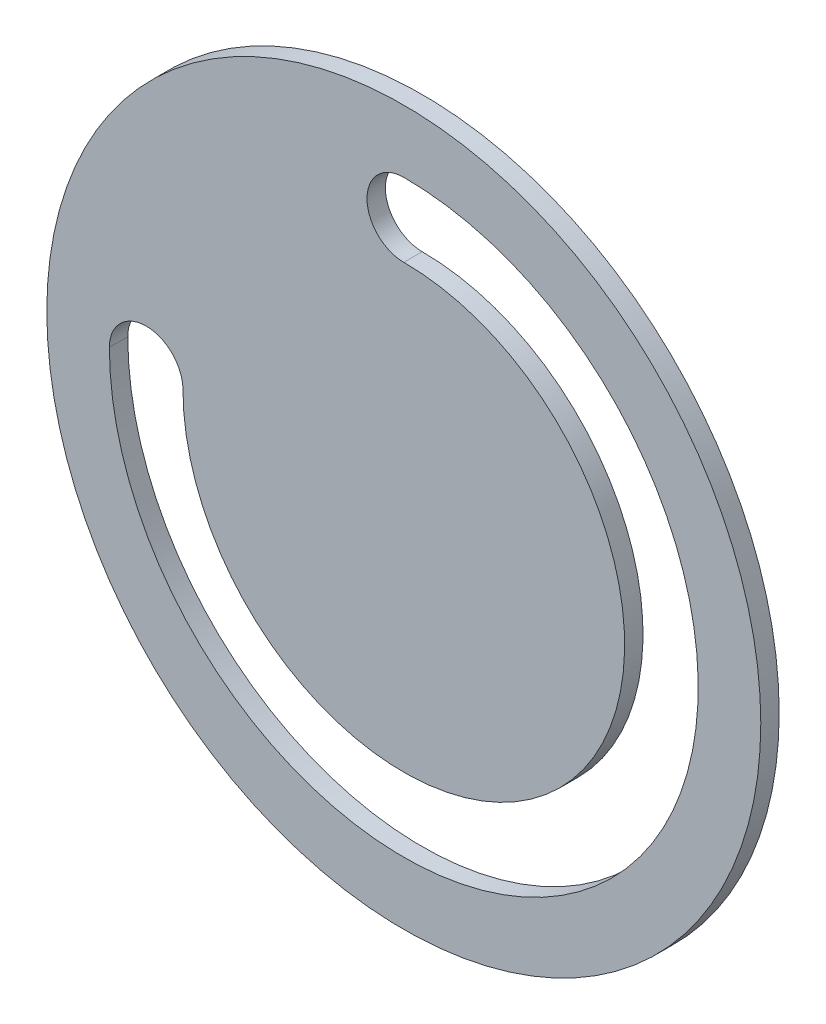
ISO-10303-21;
HEADER;
FILE_DESCRIPTION(('STEP AP214'),'2;1');
FILE_NAME('part.step','',(''),(''),'','','');
FILE_SCHEMA(('AUTOMOTIVE_DESIGN { 1 0 10303 214 1 1 1 1 }'));
ENDSEC;
DATA;
#1=APPLICATION_CONTEXT('core data for automotive mechanical design processes');
#2=APPLICATION_PROTOCOL_DEFINITION('international standard','automotive_design',2000,#1);
#3=PRODUCT_CONTEXT('',#1,'mechanical');
#4=PRODUCT('Part','Part','',(#3));
#5=PRODUCT_RELATED_PRODUCT_CATEGORY('part','',(#4));
#6=PRODUCT_DEFINITION_FORMATION('','',#4);
#7=PRODUCT_DEFINITION_CONTEXT('part definition',#1,'design');
#8=PRODUCT_DEFINITION('design','',#6,#7);
#9=PRODUCT_DEFINITION_SHAPE('','',#8);
#10=(LENGTH_UNIT() NAMED_UNIT(*) SI_UNIT(.MILLI.,.METRE.));
#11=(NAMED_UNIT(*) PLANE_ANGLE_UNIT() SI_UNIT($,.RADIAN.));
#12=(NAMED_UNIT(*) SI_UNIT($,.STERADIAN.) SOLID_ANGLE_UNIT());
#13=UNCERTAINTY_MEASURE_WITH_UNIT(LENGTH_MEASURE(1.E-05),#10,'distance_accuracy_value','');
#14=(GEOMETRIC_REPRESENTATION_CONTEXT(3) GLOBAL_UNCERTAINTY_ASSIGNED_CONTEXT((#13)) GLOBAL_UNIT_ASSIGNED_CONTEXT((#10,
#11,#12)) REPRESENTATION_CONTEXT('',''));
#15=CARTESIAN_POINT('',(0.,0.,0.));
#16=DIRECTION('',(0.,0.,1.));
#17=DIRECTION('',(1.,0.,0.));
#18=AXIS2_PLACEMENT_3D('',#15,#16,#17);
#19=CARTESIAN_POINT('',(0.,0.,0.5));
#20=DIRECTION('',(0.,0.,-1.));
#21=DIRECTION('',(-1.,0.,0.));
#22=AXIS2_PLACEMENT_3D('',#19,#20,#21);
#23=CYLINDRICAL_SURFACE('',#22,9.7);
#24=CARTESIAN_POINT('',(0.,0.,0.5));
#25=DIRECTION('',(0.,0.,1.));
#26=DIRECTION('',(1.,0.,0.));
#27=AXIS2_PLACEMENT_3D('',#24,#25,#26);
#28=CIRCLE('',#27,9.7);
#29=CARTESIAN_POINT('',(9.7,0.,0.5));
#30=VERTEX_POINT('',#29);
#31=EDGE_CURVE('E11',#30,#30,#28,.T.);
#32=ORIENTED_EDGE('',*,*,#31,.F.);
#33=EDGE_LOOP('',(#32));
#34=FACE_BOUND('',#33,.T.);
#35=CARTESIAN_POINT('',(0.,0.,0.));
#36=DIRECTION('',(0.,0.,1.));
#37=DIRECTION('',(1.,0.,0.));
#38=AXIS2_PLACEMENT_3D('',#35,#36,#37);
#39=CIRCLE('',#38,9.7);
#40=CARTESIAN_POINT('',(9.7,0.,0.));
#41=VERTEX_POINT('',#40);
#42=EDGE_CURVE('E48',#41,#41,#39,.T.);
#43=ORIENTED_EDGE('',*,*,#42,.T.);
#44=EDGE_LOOP('',(#43));
#45=FACE_BOUND('',#44,.T.);
#46=ADVANCED_FACE('F45',(#34,#45),#23,.T.);
#47=CARTESIAN_POINT('',(0.,0.,0.5));
#48=DIRECTION('',(0.,0.,1.));
#49=DIRECTION('',(1.,0.,0.));
#50=AXIS2_PLACEMENT_3D('',#47,#48,#49);
#51=PLANE('',#50);
#52=CARTESIAN_POINT('',(-7.,0.,0.5));
#53=DIRECTION('',(0.,0.,1.));
#54=DIRECTION('',(1.,0.,0.));
#55=AXIS2_PLACEMENT_3D('',#52,#53,#54);
#56=CIRCLE('',#55,1.);
#57=CARTESIAN_POINT('',(-6.,0.,0.5));
#58=VERTEX_POINT('',#57);
#59=CARTESIAN_POINT('',(-8.,0.,0.5));
#60=VERTEX_POINT('',#59);
#61=EDGE_CURVE('E59',#58,#60,#56,.T.);
#62=ORIENTED_EDGE('',*,*,#61,.F.);
#63=CARTESIAN_POINT('',(0.,0.,0.5));
#64=DIRECTION('',(0.,0.,-1.));
#65=DIRECTION('',(1.,0.,0.));
#66=AXIS2_PLACEMENT_3D('',#63,#64,#65);
#67=CIRCLE('',#66,6.);
#68=CARTESIAN_POINT('',(0.,6.,0.5));
#69=VERTEX_POINT('',#68);
#70=EDGE_CURVE('E103',#69,#58,#67,.T.);
#71=ORIENTED_EDGE('',*,*,#70,.F.);
#72=CARTESIAN_POINT('',(0.,7.,0.5));
#73=DIRECTION('',(0.,0.,1.));
#74=DIRECTION('',(1.,0.,0.));
#75=AXIS2_PLACEMENT_3D('',#72,#73,#74);
#76=CIRCLE('',#75,1.);
#77=CARTESIAN_POINT('',(0.,8.,0.5));
#78=VERTEX_POINT('',#77);
#79=EDGE_CURVE('E106',#78,#69,#76,.T.);
#80=ORIENTED_EDGE('',*,*,#79,.F.);
#81=CARTESIAN_POINT('',(0.,0.,0.5));
#82=DIRECTION('',(0.,0.,1.));
#83=DIRECTION('',(1.,0.,0.));
#84=AXIS2_PLACEMENT_3D('',#81,#82,#83);
#85=CIRCLE('',#84,8.);
#86=EDGE_CURVE('E112',#60,#78,#85,.T.);
#87=ORIENTED_EDGE('',*,*,#86,.F.);
#88=EDGE_LOOP('',(#62,#71,#80,#87));
#89=FACE_BOUND('',#88,.T.);
#90=ORIENTED_EDGE('',*,*,#31,.T.);
#91=EDGE_LOOP('',(#90));
#92=FACE_BOUND('',#91,.T.);
#93=ADVANCED_FACE('F124',(#89,#92),#51,.T.);
#94=CARTESIAN_POINT('',(0.,0.,0.));
#95=DIRECTION('',(0.,0.,1.));
#96=DIRECTION('',(1.,0.,0.));
#97=AXIS2_PLACEMENT_3D('',#94,#95,#96);
#98=PLANE('',#97);
#99=CARTESIAN_POINT('',(0.,0.,0.));
#100=DIRECTION('',(0.,0.,-1.));
#101=DIRECTION('',(1.,0.,0.));
#102=AXIS2_PLACEMENT_3D('',#99,#100,#101);
#103=CIRCLE('',#102,6.);
#104=CARTESIAN_POINT('',(0.,6.,0.));
#105=VERTEX_POINT('',#104);
#106=CARTESIAN_POINT('',(-6.,0.,0.));
#107=VERTEX_POINT('',#106);
#108=EDGE_CURVE('E93',#105,#107,#103,.T.);
#109=ORIENTED_EDGE('',*,*,#108,.T.);
#110=CARTESIAN_POINT('',(-7.,0.,0.));
#111=DIRECTION('',(0.,0.,1.));
#112=DIRECTION('',(1.,0.,0.));
#113=AXIS2_PLACEMENT_3D('',#110,#111,#112);
#114=CIRCLE('',#113,1.);
#115=CARTESIAN_POINT('',(-8.,0.,0.));
#116=VERTEX_POINT('',#115);
#117=EDGE_CURVE('E87',#107,#116,#114,.T.);
#118=ORIENTED_EDGE('',*,*,#117,.T.);
#119=CARTESIAN_POINT('',(0.,0.,0.));
#120=DIRECTION('',(0.,0.,1.));
#121=DIRECTION('',(1.,0.,0.));
#122=AXIS2_PLACEMENT_3D('',#119,#120,#121);
#123=CIRCLE('',#122,8.);
#124=CARTESIAN_POINT('',(0.,8.,0.));
#125=VERTEX_POINT('',#124);
#126=EDGE_CURVE('E96',#116,#125,#123,.T.);
#127=ORIENTED_EDGE('',*,*,#126,.T.);
#128=CARTESIAN_POINT('',(0.,7.,0.));
#129=DIRECTION('',(0.,0.,1.));
#130=DIRECTION('',(1.,0.,0.));
#131=AXIS2_PLACEMENT_3D('',#128,#129,#130);
#132=CIRCLE('',#131,1.);
#133=EDGE_CURVE('E67',#125,#105,#132,.T.);
#134=ORIENTED_EDGE('',*,*,#133,.T.);
#135=EDGE_LOOP('',(#109,#118,#127,#134));
#136=FACE_BOUND('',#135,.T.);
#137=ORIENTED_EDGE('',*,*,#42,.F.);
#138=EDGE_LOOP('',(#137));
#139=FACE_BOUND('',#138,.T.);
#140=ADVANCED_FACE('F100',(#136,#139),#98,.F.);
#141=CARTESIAN_POINT('',(-7.,0.,0.));
#142=DIRECTION('',(0.,0.,1.));
#143=DIRECTION('',(1.,0.,0.));
#144=AXIS2_PLACEMENT_3D('',#141,#142,#143);
#145=CYLINDRICAL_SURFACE('',#144,1.);
#146=ORIENTED_EDGE('',*,*,#61,.T.);
#147=DIRECTION('',(0.,0.,1.));
#148=VECTOR('',#147,1.);
#149=CARTESIAN_POINT('',(-8.,0.,0.));
#150=LINE('',#149,#148);
#151=EDGE_CURVE('E83',#116,#60,#150,.T.);
#152=ORIENTED_EDGE('',*,*,#151,.F.);
#153=ORIENTED_EDGE('',*,*,#117,.F.);
#154=DIRECTION('',(0.,0.,1.));
#155=VECTOR('',#154,1.);
#156=CARTESIAN_POINT('',(-6.,0.,0.));
#157=LINE('',#156,#155);
#158=EDGE_CURVE('E116',#107,#58,#157,.T.);
#159=ORIENTED_EDGE('',*,*,#158,.T.);
#160=EDGE_LOOP('',(#146,#152,#153,#159));
#161=FACE_BOUND('',#160,.T.);
#162=ADVANCED_FACE('F85',(#161),#145,.F.);
#163=CARTESIAN_POINT('',(0.,0.,0.));
#164=DIRECTION('',(0.,0.,1.));
#165=DIRECTION('',(1.,0.,0.));
#166=AXIS2_PLACEMENT_3D('',#163,#164,#165);
#167=CYLINDRICAL_SURFACE('',#166,6.);
#168=ORIENTED_EDGE('',*,*,#70,.T.);
#169=ORIENTED_EDGE('',*,*,#158,.F.);
#170=ORIENTED_EDGE('',*,*,#108,.F.);
#171=DIRECTION('',(0.,0.,1.));
#172=VECTOR('',#171,1.);
#173=CARTESIAN_POINT('',(0.,6.,0.));
#174=LINE('',#173,#172);
#175=EDGE_CURVE('E118',#105,#69,#174,.T.);
#176=ORIENTED_EDGE('',*,*,#175,.T.);
#177=EDGE_LOOP('',(#168,#169,#170,#176));
#178=FACE_BOUND('',#177,.T.);
#179=ADVANCED_FACE('F127',(#178),#167,.T.);
#180=CARTESIAN_POINT('',(0.,7.,0.));
#181=DIRECTION('',(0.,0.,1.));
#182=DIRECTION('',(1.,0.,0.));
#183=AXIS2_PLACEMENT_3D('',#180,#181,#182);
#184=CYLINDRICAL_SURFACE('',#183,1.);
#185=ORIENTED_EDGE('',*,*,#79,.T.);
#186=ORIENTED_EDGE('',*,*,#175,.F.);
#187=ORIENTED_EDGE('',*,*,#133,.F.);
#188=DIRECTION('',(0.,0.,1.));
#189=VECTOR('',#188,1.);
#190=CARTESIAN_POINT('',(0.,8.,0.));
#191=LINE('',#190,#189);
#192=EDGE_CURVE('E92',#125,#78,#191,.T.);
#193=ORIENTED_EDGE('',*,*,#192,.T.);
#194=EDGE_LOOP('',(#185,#186,#187,#193));
#195=FACE_BOUND('',#194,.T.);
#196=ADVANCED_FACE('F120',(#195),#184,.F.);
#197=CARTESIAN_POINT('',(0.,0.,0.));
#198=DIRECTION('',(0.,0.,1.));
#199=DIRECTION('',(1.,0.,0.));
#200=AXIS2_PLACEMENT_3D('',#197,#198,#199);
#201=CYLINDRICAL_SURFACE('',#200,8.);
#202=ORIENTED_EDGE('',*,*,#86,.T.);
#203=ORIENTED_EDGE('',*,*,#192,.F.);
#204=ORIENTED_EDGE('',*,*,#126,.F.);
#205=ORIENTED_EDGE('',*,*,#151,.T.);
#206=EDGE_LOOP('',(#202,#203,#204,#205));
#207=FACE_BOUND('',#206,.T.);
#208=ADVANCED_FACE('F97',(#207),#201,.F.);
#209=CLOSED_SHELL('',(#46,#93,#140,#162,#179,#196,#208));
#210=MANIFOLD_SOLID_BREP('B2',#209);
#211=ADVANCED_BREP_SHAPE_REPRESENTATION('',(#18,#210),#14);
#212=SHAPE_DEFINITION_REPRESENTATION(#9,#211);
ENDSEC;
END-ISO-10303-21;
